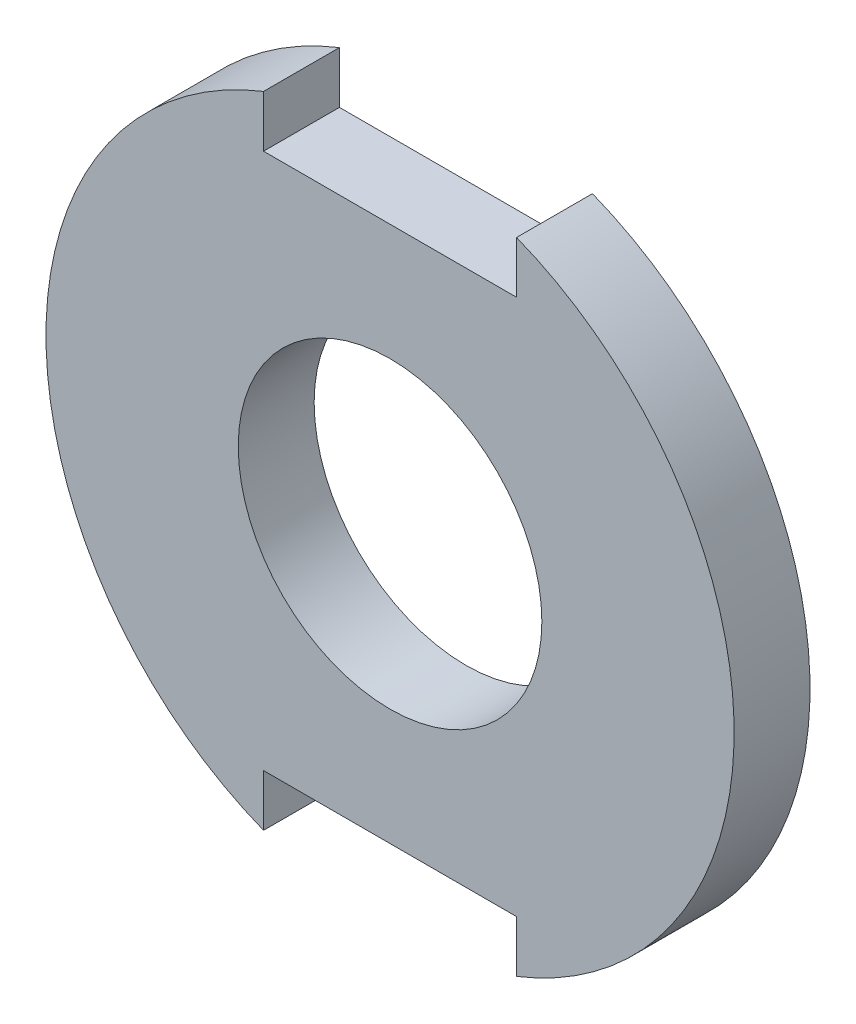
ISO-10303-21;
HEADER;
FILE_DESCRIPTION(('STEP AP214'),'2;1');
FILE_NAME('part.step','',(''),(''),'','','');
FILE_SCHEMA(('AUTOMOTIVE_DESIGN { 1 0 10303 214 1 1 1 1 }'));
ENDSEC;
DATA;
#1=APPLICATION_CONTEXT('core data for automotive mechanical design processes');
#2=APPLICATION_PROTOCOL_DEFINITION('international standard','automotive_design',2000,#1);
#3=PRODUCT_CONTEXT('',#1,'mechanical');
#4=PRODUCT('Part','Part','',(#3));
#5=PRODUCT_RELATED_PRODUCT_CATEGORY('part','',(#4));
#6=PRODUCT_DEFINITION_FORMATION('','',#4);
#7=PRODUCT_DEFINITION_CONTEXT('part definition',#1,'design');
#8=PRODUCT_DEFINITION('design','',#6,#7);
#9=PRODUCT_DEFINITION_SHAPE('','',#8);
#10=(LENGTH_UNIT() NAMED_UNIT(*) SI_UNIT(.MILLI.,.METRE.));
#11=(NAMED_UNIT(*) PLANE_ANGLE_UNIT() SI_UNIT($,.RADIAN.));
#12=(NAMED_UNIT(*) SI_UNIT($,.STERADIAN.) SOLID_ANGLE_UNIT());
#13=UNCERTAINTY_MEASURE_WITH_UNIT(LENGTH_MEASURE(1.E-05),#10,'distance_accuracy_value','');
#14=(GEOMETRIC_REPRESENTATION_CONTEXT(3) GLOBAL_UNCERTAINTY_ASSIGNED_CONTEXT((#13)) GLOBAL_UNIT_ASSIGNED_CONTEXT((#10,
#11,#12)) REPRESENTATION_CONTEXT('',''));
#15=CARTESIAN_POINT('',(0.,0.,0.));
#16=DIRECTION('',(0.,0.,1.));
#17=DIRECTION('',(1.,0.,0.));
#18=AXIS2_PLACEMENT_3D('',#15,#16,#17);
#19=CARTESIAN_POINT('',(0.,0.,3.));
#20=DIRECTION('',(0.,0.,-1.));
#21=DIRECTION('',(-1.,0.,0.));
#22=AXIS2_PLACEMENT_3D('',#19,#20,#21);
#23=CYLINDRICAL_SURFACE('',#22,13.6);
#24=CARTESIAN_POINT('',(0.,0.,0.));
#25=DIRECTION('',(0.,0.,1.));
#26=DIRECTION('',(1.,0.,0.));
#27=AXIS2_PLACEMENT_3D('',#24,#25,#26);
#28=CIRCLE('',#27,13.6);
#29=CARTESIAN_POINT('',(-5.,12.6475294030099,0.));
#30=VERTEX_POINT('',#29);
#31=CARTESIAN_POINT('',(-5.,-12.6475294030099,0.));
#32=VERTEX_POINT('',#31);
#33=EDGE_CURVE('E189',#30,#32,#28,.T.);
#34=ORIENTED_EDGE('',*,*,#33,.T.);
#35=DIRECTION('',(0.,0.,-1.));
#36=VECTOR('',#35,1.);
#37=CARTESIAN_POINT('',(-5.,-12.6475294030099,3.));
#38=LINE('',#37,#36);
#39=CARTESIAN_POINT('',(-5.,-12.6475294030099,3.));
#40=VERTEX_POINT('',#39);
#41=EDGE_CURVE('E11',#32,#40,#38,.F.);
#42=ORIENTED_EDGE('',*,*,#41,.T.);
#43=CARTESIAN_POINT('',(0.,0.,3.));
#44=DIRECTION('',(0.,0.,1.));
#45=DIRECTION('',(1.,0.,0.));
#46=AXIS2_PLACEMENT_3D('',#43,#44,#45);
#47=CIRCLE('',#46,13.6);
#48=CARTESIAN_POINT('',(-5.,12.6475294030099,3.));
#49=VERTEX_POINT('',#48);
#50=EDGE_CURVE('E135',#49,#40,#47,.T.);
#51=ORIENTED_EDGE('',*,*,#50,.F.);
#52=DIRECTION('',(0.,0.,-1.));
#53=VECTOR('',#52,1.);
#54=CARTESIAN_POINT('',(-5.,12.6475294030099,3.));
#55=LINE('',#54,#53);
#56=EDGE_CURVE('E196',#49,#30,#55,.T.);
#57=ORIENTED_EDGE('',*,*,#56,.T.);
#58=EDGE_LOOP('',(#34,#42,#51,#57));
#59=FACE_BOUND('',#58,.T.);
#60=ADVANCED_FACE('F43',(#59),#23,.T.);
#61=CARTESIAN_POINT('',(0.,0.,3.));
#62=DIRECTION('',(0.,0.,1.));
#63=DIRECTION('',(1.,0.,0.));
#64=AXIS2_PLACEMENT_3D('',#61,#62,#63);
#65=PLANE('',#64);
#66=DIRECTION('',(0.,1.,0.));
#67=VECTOR('',#66,1.);
#68=CARTESIAN_POINT('',(-5.,-10.6,3.));
#69=LINE('',#68,#67);
#70=CARTESIAN_POINT('',(-5.,-10.6,3.));
#71=VERTEX_POINT('',#70);
#72=EDGE_CURVE('E112',#40,#71,#69,.T.);
#73=ORIENTED_EDGE('',*,*,#72,.T.);
#74=DIRECTION('',(1.,0.,0.));
#75=VECTOR('',#74,1.);
#76=CARTESIAN_POINT('',(5.,-10.6,3.));
#77=LINE('',#76,#75);
#78=CARTESIAN_POINT('',(5.,-10.6,3.));
#79=VERTEX_POINT('',#78);
#80=EDGE_CURVE('E123',#71,#79,#77,.T.);
#81=ORIENTED_EDGE('',*,*,#80,.T.);
#82=DIRECTION('',(0.,-1.,0.));
#83=VECTOR('',#82,1.);
#84=CARTESIAN_POINT('',(5.,-10.6,3.));
#85=LINE('',#84,#83);
#86=CARTESIAN_POINT('',(5.,-12.6475294030099,3.));
#87=VERTEX_POINT('',#86);
#88=EDGE_CURVE('E120',#79,#87,#85,.T.);
#89=ORIENTED_EDGE('',*,*,#88,.T.);
#90=CARTESIAN_POINT('',(5.,12.6475294030099,3.));
#91=VERTEX_POINT('',#90);
#92=EDGE_CURVE('E185',#87,#91,#47,.T.);
#93=ORIENTED_EDGE('',*,*,#92,.T.);
#94=DIRECTION('',(0.,-1.,0.));
#95=VECTOR('',#94,1.);
#96=CARTESIAN_POINT('',(5.,16.6,3.));
#97=LINE('',#96,#95);
#98=CARTESIAN_POINT('',(5.,10.6,3.));
#99=VERTEX_POINT('',#98);
#100=EDGE_CURVE('E67',#91,#99,#97,.T.);
#101=ORIENTED_EDGE('',*,*,#100,.T.);
#102=DIRECTION('',(-1.,0.,0.));
#103=VECTOR('',#102,1.);
#104=CARTESIAN_POINT('',(5.,10.6,3.));
#105=LINE('',#104,#103);
#106=CARTESIAN_POINT('',(-5.,10.6,3.));
#107=VERTEX_POINT('',#106);
#108=EDGE_CURVE('E156',#99,#107,#105,.T.);
#109=ORIENTED_EDGE('',*,*,#108,.T.);
#110=DIRECTION('',(0.,1.,0.));
#111=VECTOR('',#110,1.);
#112=CARTESIAN_POINT('',(-5.,16.6,3.));
#113=LINE('',#112,#111);
#114=EDGE_CURVE('E165',#107,#49,#113,.T.);
#115=ORIENTED_EDGE('',*,*,#114,.T.);
#116=ORIENTED_EDGE('',*,*,#50,.T.);
#117=EDGE_LOOP('',(#73,#81,#89,#93,#101,#109,#115,#116));
#118=FACE_BOUND('',#117,.T.);
#119=CARTESIAN_POINT('',(0.,0.,3.));
#120=DIRECTION('',(0.,0.,1.));
#121=DIRECTION('',(1.,0.,0.));
#122=AXIS2_PLACEMENT_3D('',#119,#120,#121);
#123=CIRCLE('',#122,6.);
#124=CARTESIAN_POINT('',(6.,0.,3.));
#125=VERTEX_POINT('',#124);
#126=EDGE_CURVE('E177',#125,#125,#123,.T.);
#127=ORIENTED_EDGE('',*,*,#126,.F.);
#128=EDGE_LOOP('',(#127));
#129=FACE_BOUND('',#128,.T.);
#130=ADVANCED_FACE('F131',(#118,#129),#65,.T.);
#131=CARTESIAN_POINT('',(0.,0.,0.));
#132=DIRECTION('',(0.,0.,1.));
#133=DIRECTION('',(1.,0.,0.));
#134=AXIS2_PLACEMENT_3D('',#131,#132,#133);
#135=PLANE('',#134);
#136=DIRECTION('',(1.,0.,0.));
#137=VECTOR('',#136,1.);
#138=CARTESIAN_POINT('',(5.,-10.6,0.));
#139=LINE('',#138,#137);
#140=CARTESIAN_POINT('',(-5.,-10.6,0.));
#141=VERTEX_POINT('',#140);
#142=CARTESIAN_POINT('',(5.,-10.6,0.));
#143=VERTEX_POINT('',#142);
#144=EDGE_CURVE('E139',#141,#143,#139,.T.);
#145=ORIENTED_EDGE('',*,*,#144,.F.);
#146=DIRECTION('',(0.,1.,0.));
#147=VECTOR('',#146,1.);
#148=CARTESIAN_POINT('',(-5.,-10.6,0.));
#149=LINE('',#148,#147);
#150=EDGE_CURVE('E114',#32,#141,#149,.T.);
#151=ORIENTED_EDGE('',*,*,#150,.F.);
#152=ORIENTED_EDGE('',*,*,#33,.F.);
#153=DIRECTION('',(0.,1.,0.));
#154=VECTOR('',#153,1.);
#155=CARTESIAN_POINT('',(-5.,16.6,0.));
#156=LINE('',#155,#154);
#157=CARTESIAN_POINT('',(-5.,10.6,0.));
#158=VERTEX_POINT('',#157);
#159=EDGE_CURVE('E146',#158,#30,#156,.T.);
#160=ORIENTED_EDGE('',*,*,#159,.F.);
#161=DIRECTION('',(-1.,0.,0.));
#162=VECTOR('',#161,1.);
#163=CARTESIAN_POINT('',(5.,10.6,0.));
#164=LINE('',#163,#162);
#165=CARTESIAN_POINT('',(5.,10.6,0.));
#166=VERTEX_POINT('',#165);
#167=EDGE_CURVE('E160',#166,#158,#164,.T.);
#168=ORIENTED_EDGE('',*,*,#167,.F.);
#169=DIRECTION('',(0.,-1.,0.));
#170=VECTOR('',#169,1.);
#171=CARTESIAN_POINT('',(5.,16.6,0.));
#172=LINE('',#171,#170);
#173=CARTESIAN_POINT('',(5.,12.6475294030099,0.));
#174=VERTEX_POINT('',#173);
#175=EDGE_CURVE('E164',#174,#166,#172,.T.);
#176=ORIENTED_EDGE('',*,*,#175,.F.);
#177=CARTESIAN_POINT('',(5.,-12.6475294030099,0.));
#178=VERTEX_POINT('',#177);
#179=EDGE_CURVE('E181',#178,#174,#28,.T.);
#180=ORIENTED_EDGE('',*,*,#179,.F.);
#181=DIRECTION('',(0.,-1.,0.));
#182=VECTOR('',#181,1.);
#183=CARTESIAN_POINT('',(5.,-10.6,0.));
#184=LINE('',#183,#182);
#185=EDGE_CURVE('E59',#143,#178,#184,.T.);
#186=ORIENTED_EDGE('',*,*,#185,.F.);
#187=EDGE_LOOP('',(#145,#151,#152,#160,#168,#176,#180,#186));
#188=FACE_BOUND('',#187,.T.);
#189=CARTESIAN_POINT('',(0.,0.,0.));
#190=DIRECTION('',(0.,0.,1.));
#191=DIRECTION('',(1.,0.,0.));
#192=AXIS2_PLACEMENT_3D('',#189,#190,#191);
#193=CIRCLE('',#192,6.);
#194=CARTESIAN_POINT('',(6.,0.,0.));
#195=VERTEX_POINT('',#194);
#196=EDGE_CURVE('E150',#195,#195,#193,.T.);
#197=ORIENTED_EDGE('',*,*,#196,.T.);
#198=EDGE_LOOP('',(#197));
#199=FACE_BOUND('',#198,.T.);
#200=ADVANCED_FACE('F205',(#188,#199),#135,.F.);
#201=ORIENTED_EDGE('',*,*,#92,.F.);
#202=DIRECTION('',(0.,0.,-1.));
#203=VECTOR('',#202,1.);
#204=CARTESIAN_POINT('',(5.,-12.6475294030099,3.));
#205=LINE('',#204,#203);
#206=EDGE_CURVE('E52',#87,#178,#205,.T.);
#207=ORIENTED_EDGE('',*,*,#206,.T.);
#208=ORIENTED_EDGE('',*,*,#179,.T.);
#209=DIRECTION('',(0.,0.,-1.));
#210=VECTOR('',#209,1.);
#211=CARTESIAN_POINT('',(5.,12.6475294030099,3.));
#212=LINE('',#211,#210);
#213=EDGE_CURVE('E193',#174,#91,#212,.F.);
#214=ORIENTED_EDGE('',*,*,#213,.T.);
#215=EDGE_LOOP('',(#201,#207,#208,#214));
#216=FACE_BOUND('',#215,.T.);
#217=ADVANCED_FACE('F45',(#216),#23,.T.);
#218=CARTESIAN_POINT('',(0.,0.,3.));
#219=DIRECTION('',(0.,0.,-1.));
#220=DIRECTION('',(-1.,0.,0.));
#221=AXIS2_PLACEMENT_3D('',#218,#219,#220);
#222=CYLINDRICAL_SURFACE('',#221,6.);
#223=ORIENTED_EDGE('',*,*,#126,.T.);
#224=EDGE_LOOP('',(#223));
#225=FACE_BOUND('',#224,.T.);
#226=ORIENTED_EDGE('',*,*,#196,.F.);
#227=EDGE_LOOP('',(#226));
#228=FACE_BOUND('',#227,.T.);
#229=ADVANCED_FACE('F223',(#225,#228),#222,.F.);
#230=CARTESIAN_POINT('',(-5.,16.6,3.));
#231=DIRECTION('',(-1.,0.,0.));
#232=DIRECTION('',(0.,-1.,0.));
#233=AXIS2_PLACEMENT_3D('',#230,#231,#232);
#234=PLANE('',#233);
#235=ORIENTED_EDGE('',*,*,#114,.F.);
#236=DIRECTION('',(0.,0.,-1.));
#237=VECTOR('',#236,1.);
#238=CARTESIAN_POINT('',(-5.,10.6,3.));
#239=LINE('',#238,#237);
#240=EDGE_CURVE('E157',#107,#158,#239,.T.);
#241=ORIENTED_EDGE('',*,*,#240,.T.);
#242=ORIENTED_EDGE('',*,*,#159,.T.);
#243=ORIENTED_EDGE('',*,*,#56,.F.);
#244=EDGE_LOOP('',(#235,#241,#242,#243));
#245=FACE_BOUND('',#244,.T.);
#246=ADVANCED_FACE('F221',(#245),#234,.F.);
#247=CARTESIAN_POINT('',(5.,16.6,3.));
#248=DIRECTION('',(1.,0.,0.));
#249=DIRECTION('',(0.,0.,-1.));
#250=AXIS2_PLACEMENT_3D('',#247,#248,#249);
#251=PLANE('',#250);
#252=ORIENTED_EDGE('',*,*,#175,.T.);
#253=DIRECTION('',(0.,0.,-1.));
#254=VECTOR('',#253,1.);
#255=CARTESIAN_POINT('',(5.,10.6,3.));
#256=LINE('',#255,#254);
#257=EDGE_CURVE('E152',#99,#166,#256,.T.);
#258=ORIENTED_EDGE('',*,*,#257,.F.);
#259=ORIENTED_EDGE('',*,*,#100,.F.);
#260=ORIENTED_EDGE('',*,*,#213,.F.);
#261=EDGE_LOOP('',(#252,#258,#259,#260));
#262=FACE_BOUND('',#261,.T.);
#263=ADVANCED_FACE('F209',(#262),#251,.F.);
#264=CARTESIAN_POINT('',(5.,10.6,3.));
#265=DIRECTION('',(0.,-1.,0.));
#266=DIRECTION('',(0.,0.,-1.));
#267=AXIS2_PLACEMENT_3D('',#264,#265,#266);
#268=PLANE('',#267);
#269=ORIENTED_EDGE('',*,*,#167,.T.);
#270=ORIENTED_EDGE('',*,*,#240,.F.);
#271=ORIENTED_EDGE('',*,*,#108,.F.);
#272=ORIENTED_EDGE('',*,*,#257,.T.);
#273=EDGE_LOOP('',(#269,#270,#271,#272));
#274=FACE_BOUND('',#273,.T.);
#275=ADVANCED_FACE('F212',(#274),#268,.F.);
#276=CARTESIAN_POINT('',(-5.,-10.6,3.));
#277=DIRECTION('',(-1.,0.,0.));
#278=DIRECTION('',(0.,-1.,0.));
#279=AXIS2_PLACEMENT_3D('',#276,#277,#278);
#280=PLANE('',#279);
#281=ORIENTED_EDGE('',*,*,#150,.T.);
#282=DIRECTION('',(0.,0.,-1.));
#283=VECTOR('',#282,1.);
#284=CARTESIAN_POINT('',(-5.,-10.6,3.));
#285=LINE('',#284,#283);
#286=EDGE_CURVE('E108',#71,#141,#285,.T.);
#287=ORIENTED_EDGE('',*,*,#286,.F.);
#288=ORIENTED_EDGE('',*,*,#72,.F.);
#289=ORIENTED_EDGE('',*,*,#41,.F.);
#290=EDGE_LOOP('',(#281,#287,#288,#289));
#291=FACE_BOUND('',#290,.T.);
#292=ADVANCED_FACE('F110',(#291),#280,.F.);
#293=CARTESIAN_POINT('',(5.,-10.6,3.));
#294=DIRECTION('',(1.,0.,0.));
#295=DIRECTION('',(0.,0.,-1.));
#296=AXIS2_PLACEMENT_3D('',#293,#294,#295);
#297=PLANE('',#296);
#298=ORIENTED_EDGE('',*,*,#88,.F.);
#299=DIRECTION('',(0.,0.,-1.));
#300=VECTOR('',#299,1.);
#301=CARTESIAN_POINT('',(5.,-10.6,3.));
#302=LINE('',#301,#300);
#303=EDGE_CURVE('E119',#79,#143,#302,.T.);
#304=ORIENTED_EDGE('',*,*,#303,.T.);
#305=ORIENTED_EDGE('',*,*,#185,.T.);
#306=ORIENTED_EDGE('',*,*,#206,.F.);
#307=EDGE_LOOP('',(#298,#304,#305,#306));
#308=FACE_BOUND('',#307,.T.);
#309=ADVANCED_FACE('F214',(#308),#297,.F.);
#310=CARTESIAN_POINT('',(5.,-10.6,3.));
#311=DIRECTION('',(0.,1.,0.));
#312=DIRECTION('',(0.,0.,1.));
#313=AXIS2_PLACEMENT_3D('',#310,#311,#312);
#314=PLANE('',#313);
#315=ORIENTED_EDGE('',*,*,#144,.T.);
#316=ORIENTED_EDGE('',*,*,#303,.F.);
#317=ORIENTED_EDGE('',*,*,#80,.F.);
#318=ORIENTED_EDGE('',*,*,#286,.T.);
#319=EDGE_LOOP('',(#315,#316,#317,#318));
#320=FACE_BOUND('',#319,.T.);
#321=ADVANCED_FACE('F124',(#320),#314,.F.);
#322=CLOSED_SHELL('',(#60,#130,#200,#217,#229,#246,#263,#275,#292,#309,#321));
#323=MANIFOLD_SOLID_BREP('B2',#322);
#324=ADVANCED_BREP_SHAPE_REPRESENTATION('',(#18,#323),#14);
#325=SHAPE_DEFINITION_REPRESENTATION(#9,#324);
ENDSEC;
END-ISO-10303-21;
